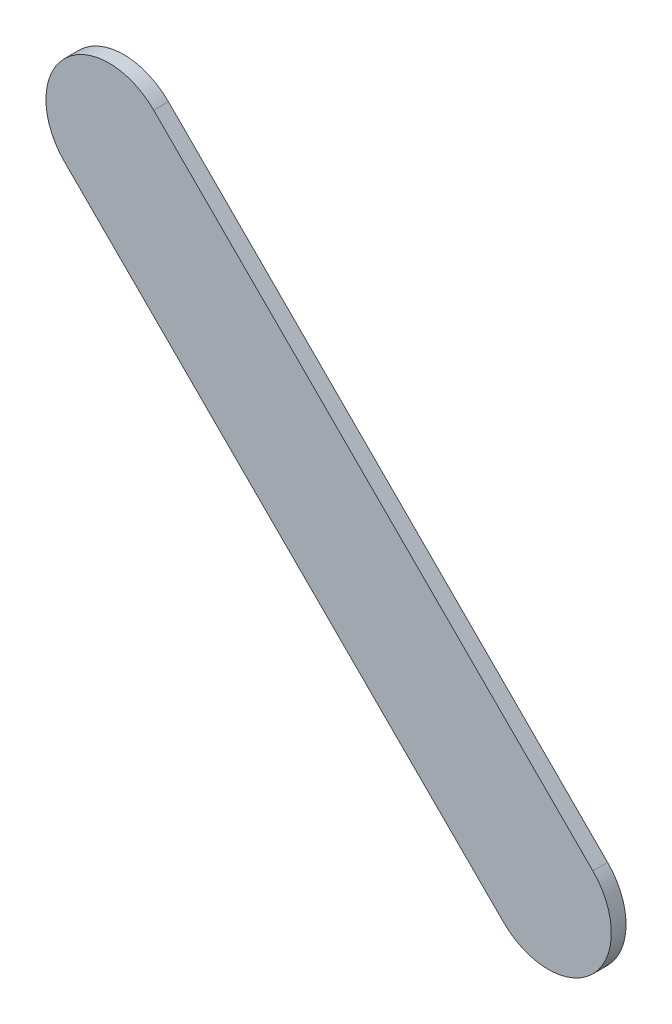
ISO-10303-21;
HEADER;
FILE_DESCRIPTION(('STEP AP214'),'2;1');
FILE_NAME('part.step','',(''),(''),'','','');
FILE_SCHEMA(('AUTOMOTIVE_DESIGN { 1 0 10303 214 1 1 1 1 }'));
ENDSEC;
DATA;
#1=APPLICATION_CONTEXT('core data for automotive mechanical design processes');
#2=APPLICATION_PROTOCOL_DEFINITION('international standard','automotive_design',2000,#1);
#3=PRODUCT_CONTEXT('',#1,'mechanical');
#4=PRODUCT('Part','Part','',(#3));
#5=PRODUCT_RELATED_PRODUCT_CATEGORY('part','',(#4));
#6=PRODUCT_DEFINITION_FORMATION('','',#4);
#7=PRODUCT_DEFINITION_CONTEXT('part definition',#1,'design');
#8=PRODUCT_DEFINITION('design','',#6,#7);
#9=PRODUCT_DEFINITION_SHAPE('','',#8);
#10=(LENGTH_UNIT() NAMED_UNIT(*) SI_UNIT(.MILLI.,.METRE.));
#11=(NAMED_UNIT(*) PLANE_ANGLE_UNIT() SI_UNIT($,.RADIAN.));
#12=(NAMED_UNIT(*) SI_UNIT($,.STERADIAN.) SOLID_ANGLE_UNIT());
#13=UNCERTAINTY_MEASURE_WITH_UNIT(LENGTH_MEASURE(1.E-05),#10,'distance_accuracy_value','');
#14=(GEOMETRIC_REPRESENTATION_CONTEXT(3) GLOBAL_UNCERTAINTY_ASSIGNED_CONTEXT((#13)) GLOBAL_UNIT_ASSIGNED_CONTEXT((#10,
#11,#12)) REPRESENTATION_CONTEXT('',''));
#15=CARTESIAN_POINT('',(0.,0.,0.));
#16=DIRECTION('',(0.,0.,1.));
#17=DIRECTION('',(1.,0.,0.));
#18=AXIS2_PLACEMENT_3D('',#15,#16,#17);
#19=CARTESIAN_POINT('',(128.590066,-114.947933,1.635));
#20=DIRECTION('',(0.,0.,1.));
#21=DIRECTION('',(1.,0.,0.));
#22=AXIS2_PLACEMENT_3D('',#19,#20,#21);
#23=PLANE('',#22);
#24=DIRECTION('',(-0.707106781186548,0.707106781186548,0.));
#25=VECTOR('',#24,1.);
#26=CARTESIAN_POINT('',(128.590066,-114.947933,1.635));
#27=LINE('',#26,#25);
#28=CARTESIAN_POINT('',(128.590066,-114.947933,1.635));
#29=VERTEX_POINT('',#28);
#30=CARTESIAN_POINT('',(127.546066,-113.903933,1.635));
#31=VERTEX_POINT('',#30);
#32=EDGE_CURVE('E81',#29,#31,#27,.T.);
#33=ORIENTED_EDGE('',*,*,#32,.T.);
#34=CARTESIAN_POINT('',(127.4399995,-114.0099995,1.635));
#35=DIRECTION('',(0.,0.,1.));
#36=DIRECTION('',(0.707106781186548,0.707106781186548,0.));
#37=AXIS2_PLACEMENT_3D('',#34,#35,#36);
#38=CIRCLE('',#37,0.150000682813);
#39=CARTESIAN_POINT('',(127.333933,-114.116066,1.635));
#40=VERTEX_POINT('',#39);
#41=EDGE_CURVE('E107',#31,#40,#38,.T.);
#42=ORIENTED_EDGE('',*,*,#41,.T.);
#43=DIRECTION('',(0.707106781186548,-0.707106781186548,0.));
#44=VECTOR('',#43,1.);
#45=CARTESIAN_POINT('',(127.333933,-114.116066,1.635));
#46=LINE('',#45,#44);
#47=CARTESIAN_POINT('',(128.377933,-115.160066,1.635));
#48=VERTEX_POINT('',#47);
#49=EDGE_CURVE('E74',#40,#48,#46,.T.);
#50=ORIENTED_EDGE('',*,*,#49,.T.);
#51=CARTESIAN_POINT('',(128.4839995,-115.0539995,1.635));
#52=DIRECTION('',(0.,0.,1.));
#53=DIRECTION('',(-0.707106781186548,-0.707106781186548,0.));
#54=AXIS2_PLACEMENT_3D('',#51,#52,#53);
#55=CIRCLE('',#54,0.150000682813);
#56=EDGE_CURVE('E11',#48,#29,#55,.T.);
#57=ORIENTED_EDGE('',*,*,#56,.T.);
#58=EDGE_LOOP('',(#33,#42,#50,#57));
#59=FACE_BOUND('',#58,.T.);
#60=ADVANCED_FACE('F17',(#59),#23,.T.);
#61=CARTESIAN_POINT('',(128.590066,-114.947933,1.6));
#62=DIRECTION('',(0.,0.,1.));
#63=DIRECTION('',(1.,0.,0.));
#64=AXIS2_PLACEMENT_3D('',#61,#62,#63);
#65=PLANE('',#64);
#66=CARTESIAN_POINT('',(128.4839995,-115.0539995,1.6));
#67=DIRECTION('',(0.,0.,1.));
#68=DIRECTION('',(-0.707106781186548,-0.707106781186548,0.));
#69=AXIS2_PLACEMENT_3D('',#66,#67,#68);
#70=CIRCLE('',#69,0.150000682813);
#71=CARTESIAN_POINT('',(128.377933,-115.160066,1.6));
#72=VERTEX_POINT('',#71);
#73=CARTESIAN_POINT('',(128.590066,-114.947933,1.6));
#74=VERTEX_POINT('',#73);
#75=EDGE_CURVE('E25',#72,#74,#70,.T.);
#76=ORIENTED_EDGE('',*,*,#75,.F.);
#77=DIRECTION('',(0.707106781186548,-0.707106781186548,0.));
#78=VECTOR('',#77,1.);
#79=CARTESIAN_POINT('',(127.333933,-114.116066,1.6));
#80=LINE('',#79,#78);
#81=CARTESIAN_POINT('',(127.333933,-114.116066,1.6));
#82=VERTEX_POINT('',#81);
#83=EDGE_CURVE('E111',#82,#72,#80,.T.);
#84=ORIENTED_EDGE('',*,*,#83,.F.);
#85=CARTESIAN_POINT('',(127.4399995,-114.0099995,1.6));
#86=DIRECTION('',(0.,0.,1.));
#87=DIRECTION('',(0.707106781186548,0.707106781186548,0.));
#88=AXIS2_PLACEMENT_3D('',#85,#86,#87);
#89=CIRCLE('',#88,0.150000682813);
#90=CARTESIAN_POINT('',(127.546066,-113.903933,1.6));
#91=VERTEX_POINT('',#90);
#92=EDGE_CURVE('E83',#91,#82,#89,.T.);
#93=ORIENTED_EDGE('',*,*,#92,.F.);
#94=DIRECTION('',(-0.707106781186548,0.707106781186548,0.));
#95=VECTOR('',#94,1.);
#96=CARTESIAN_POINT('',(128.590066,-114.947933,1.6));
#97=LINE('',#96,#95);
#98=EDGE_CURVE('E79',#74,#91,#97,.T.);
#99=ORIENTED_EDGE('',*,*,#98,.F.);
#100=EDGE_LOOP('',(#76,#84,#93,#99));
#101=FACE_BOUND('',#100,.T.);
#102=ADVANCED_FACE('F85',(#101),#65,.F.);
#103=CARTESIAN_POINT('',(128.4839995,-115.0539995,1.6));
#104=DIRECTION('',(0.,0.,-1.));
#105=DIRECTION('',(-0.707106781186548,-0.707106781186548,0.));
#106=AXIS2_PLACEMENT_3D('',#103,#104,#105);
#107=CYLINDRICAL_SURFACE('',#106,0.150000682813);
#108=ORIENTED_EDGE('',*,*,#75,.T.);
#109=DIRECTION('',(0.,0.,1.));
#110=VECTOR('',#109,1.);
#111=CARTESIAN_POINT('',(128.590066,-114.947933,1.6));
#112=LINE('',#111,#110);
#113=EDGE_CURVE('E68',#74,#29,#112,.T.);
#114=ORIENTED_EDGE('',*,*,#113,.T.);
#115=ORIENTED_EDGE('',*,*,#56,.F.);
#116=DIRECTION('',(0.,0.,1.));
#117=VECTOR('',#116,1.);
#118=CARTESIAN_POINT('',(128.377933,-115.160066,1.6));
#119=LINE('',#118,#117);
#120=EDGE_CURVE('E71',#72,#48,#119,.T.);
#121=ORIENTED_EDGE('',*,*,#120,.F.);
#122=EDGE_LOOP('',(#108,#114,#115,#121));
#123=FACE_BOUND('',#122,.T.);
#124=ADVANCED_FACE('F67',(#123),#107,.T.);
#125=CARTESIAN_POINT('',(127.333933,-114.116066,1.6));
#126=DIRECTION('',(0.707106781186548,0.707106781186548,0.));
#127=DIRECTION('',(0.,0.,-1.));
#128=AXIS2_PLACEMENT_3D('',#125,#126,#127);
#129=PLANE('',#128);
#130=ORIENTED_EDGE('',*,*,#83,.T.);
#131=ORIENTED_EDGE('',*,*,#120,.T.);
#132=ORIENTED_EDGE('',*,*,#49,.F.);
#133=DIRECTION('',(0.,0.,1.));
#134=VECTOR('',#133,1.);
#135=CARTESIAN_POINT('',(127.333933,-114.116066,1.6));
#136=LINE('',#135,#134);
#137=EDGE_CURVE('E103',#82,#40,#136,.T.);
#138=ORIENTED_EDGE('',*,*,#137,.F.);
#139=EDGE_LOOP('',(#130,#131,#132,#138));
#140=FACE_BOUND('',#139,.T.);
#141=ADVANCED_FACE('F119',(#140),#129,.F.);
#142=CARTESIAN_POINT('',(127.4399995,-114.0099995,1.6));
#143=DIRECTION('',(0.,0.,-1.));
#144=DIRECTION('',(0.707106781186548,0.707106781186548,0.));
#145=AXIS2_PLACEMENT_3D('',#142,#143,#144);
#146=CYLINDRICAL_SURFACE('',#145,0.150000682813);
#147=ORIENTED_EDGE('',*,*,#92,.T.);
#148=ORIENTED_EDGE('',*,*,#137,.T.);
#149=ORIENTED_EDGE('',*,*,#41,.F.);
#150=DIRECTION('',(0.,0.,1.));
#151=VECTOR('',#150,1.);
#152=CARTESIAN_POINT('',(127.546066,-113.903933,1.6));
#153=LINE('',#152,#151);
#154=EDGE_CURVE('E89',#91,#31,#153,.T.);
#155=ORIENTED_EDGE('',*,*,#154,.F.);
#156=EDGE_LOOP('',(#147,#148,#149,#155));
#157=FACE_BOUND('',#156,.T.);
#158=ADVANCED_FACE('F121',(#157),#146,.T.);
#159=CARTESIAN_POINT('',(128.590066,-114.947933,1.6));
#160=DIRECTION('',(-0.707106781186548,-0.707106781186548,0.));
#161=DIRECTION('',(-0.707106781186548,0.707106781186548,0.));
#162=AXIS2_PLACEMENT_3D('',#159,#160,#161);
#163=PLANE('',#162);
#164=ORIENTED_EDGE('',*,*,#98,.T.);
#165=ORIENTED_EDGE('',*,*,#154,.T.);
#166=ORIENTED_EDGE('',*,*,#32,.F.);
#167=ORIENTED_EDGE('',*,*,#113,.F.);
#168=EDGE_LOOP('',(#164,#165,#166,#167));
#169=FACE_BOUND('',#168,.T.);
#170=ADVANCED_FACE('F77',(#169),#163,.F.);
#171=CLOSED_SHELL('',(#60,#102,#124,#141,#158,#170));
#172=MANIFOLD_SOLID_BREP('B1',#171);
#173=ADVANCED_BREP_SHAPE_REPRESENTATION('',(#18,#172),#14);
#174=SHAPE_DEFINITION_REPRESENTATION(#9,#173);
ENDSEC;
END-ISO-10303-21;
